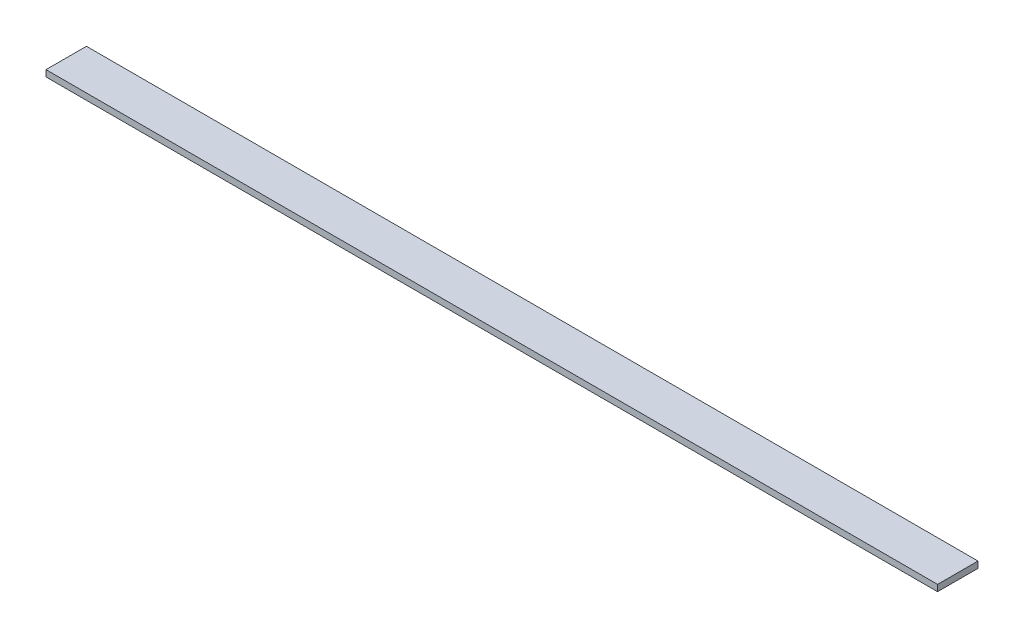
ISO-10303-21;
HEADER;
FILE_DESCRIPTION(('STEP AP214'),'2;1');
FILE_NAME('part.step','',(''),(''),'','','');
FILE_SCHEMA(('AUTOMOTIVE_DESIGN { 1 0 10303 214 1 1 1 1 }'));
ENDSEC;
DATA;
#1=APPLICATION_CONTEXT('core data for automotive mechanical design processes');
#2=APPLICATION_PROTOCOL_DEFINITION('international standard','automotive_design',2000,#1);
#3=PRODUCT_CONTEXT('',#1,'mechanical');
#4=PRODUCT('Part','Part','',(#3));
#5=PRODUCT_RELATED_PRODUCT_CATEGORY('part','',(#4));
#6=PRODUCT_DEFINITION_FORMATION('','',#4);
#7=PRODUCT_DEFINITION_CONTEXT('part definition',#1,'design');
#8=PRODUCT_DEFINITION('design','',#6,#7);
#9=PRODUCT_DEFINITION_SHAPE('','',#8);
#10=(LENGTH_UNIT() NAMED_UNIT(*) SI_UNIT(.MILLI.,.METRE.));
#11=(NAMED_UNIT(*) PLANE_ANGLE_UNIT() SI_UNIT($,.RADIAN.));
#12=(NAMED_UNIT(*) SI_UNIT($,.STERADIAN.) SOLID_ANGLE_UNIT());
#13=UNCERTAINTY_MEASURE_WITH_UNIT(LENGTH_MEASURE(1.E-05),#10,'distance_accuracy_value','');
#14=(GEOMETRIC_REPRESENTATION_CONTEXT(3) GLOBAL_UNCERTAINTY_ASSIGNED_CONTEXT((#13)) GLOBAL_UNIT_ASSIGNED_CONTEXT((#10,
#11,#12)) REPRESENTATION_CONTEXT('',''));
#15=CARTESIAN_POINT('',(0.,0.,0.));
#16=DIRECTION('',(0.,0.,1.));
#17=DIRECTION('',(1.,0.,0.));
#18=AXIS2_PLACEMENT_3D('',#15,#16,#17);
#19=CARTESIAN_POINT('',(0.,2.,0.));
#20=DIRECTION('',(-1.,0.,0.));
#21=DIRECTION('',(0.,0.,1.));
#22=AXIS2_PLACEMENT_3D('',#19,#20,#21);
#23=PLANE('',#22);
#24=DIRECTION('',(0.,0.,-1.));
#25=VECTOR('',#24,1.);
#26=CARTESIAN_POINT('',(0.,0.,0.));
#27=LINE('',#26,#25);
#28=CARTESIAN_POINT('',(0.,0.,12.7));
#29=VERTEX_POINT('',#28);
#30=CARTESIAN_POINT('',(0.,0.,0.));
#31=VERTEX_POINT('',#30);
#32=EDGE_CURVE('E107',#29,#31,#27,.T.);
#33=ORIENTED_EDGE('',*,*,#32,.T.);
#34=DIRECTION('',(0.,-1.,0.));
#35=VECTOR('',#34,1.);
#36=CARTESIAN_POINT('',(0.,2.,0.));
#37=LINE('',#36,#35);
#38=CARTESIAN_POINT('',(0.,2.,0.));
#39=VERTEX_POINT('',#38);
#40=EDGE_CURVE('E11',#39,#31,#37,.T.);
#41=ORIENTED_EDGE('',*,*,#40,.F.);
#42=DIRECTION('',(0.,0.,-1.));
#43=VECTOR('',#42,1.);
#44=CARTESIAN_POINT('',(0.,2.,0.));
#45=LINE('',#44,#43);
#46=CARTESIAN_POINT('',(0.,2.,12.7));
#47=VERTEX_POINT('',#46);
#48=EDGE_CURVE('E91',#47,#39,#45,.T.);
#49=ORIENTED_EDGE('',*,*,#48,.F.);
#50=DIRECTION('',(0.,-1.,0.));
#51=VECTOR('',#50,1.);
#52=CARTESIAN_POINT('',(0.,2.,12.7));
#53=LINE('',#52,#51);
#54=EDGE_CURVE('E103',#47,#29,#53,.T.);
#55=ORIENTED_EDGE('',*,*,#54,.T.);
#56=EDGE_LOOP('',(#33,#41,#49,#55));
#57=FACE_BOUND('',#56,.T.);
#58=ADVANCED_FACE('F39',(#57),#23,.F.);
#59=CARTESIAN_POINT('',(0.,2.,0.));
#60=DIRECTION('',(0.,0.,1.));
#61=DIRECTION('',(1.,0.,0.));
#62=AXIS2_PLACEMENT_3D('',#59,#60,#61);
#63=PLANE('',#62);
#64=DIRECTION('',(-1.,0.,0.));
#65=VECTOR('',#64,1.);
#66=CARTESIAN_POINT('',(0.,0.,0.));
#67=LINE('',#66,#65);
#68=CARTESIAN_POINT('',(-280.,0.,0.));
#69=VERTEX_POINT('',#68);
#70=EDGE_CURVE('E96',#31,#69,#67,.T.);
#71=ORIENTED_EDGE('',*,*,#70,.T.);
#72=DIRECTION('',(0.,-1.,0.));
#73=VECTOR('',#72,1.);
#74=CARTESIAN_POINT('',(-280.,2.,0.));
#75=LINE('',#74,#73);
#76=CARTESIAN_POINT('',(-280.,2.,0.));
#77=VERTEX_POINT('',#76);
#78=EDGE_CURVE('E48',#77,#69,#75,.T.);
#79=ORIENTED_EDGE('',*,*,#78,.F.);
#80=DIRECTION('',(-1.,0.,0.));
#81=VECTOR('',#80,1.);
#82=CARTESIAN_POINT('',(0.,2.,0.));
#83=LINE('',#82,#81);
#84=EDGE_CURVE('E86',#39,#77,#83,.T.);
#85=ORIENTED_EDGE('',*,*,#84,.F.);
#86=ORIENTED_EDGE('',*,*,#40,.T.);
#87=EDGE_LOOP('',(#71,#79,#85,#86));
#88=FACE_BOUND('',#87,.T.);
#89=ADVANCED_FACE('F95',(#88),#63,.F.);
#90=CARTESIAN_POINT('',(-280.,2.,0.));
#91=DIRECTION('',(1.,0.,0.));
#92=DIRECTION('',(0.,0.,-1.));
#93=AXIS2_PLACEMENT_3D('',#90,#91,#92);
#94=PLANE('',#93);
#95=DIRECTION('',(0.,0.,1.));
#96=VECTOR('',#95,1.);
#97=CARTESIAN_POINT('',(-280.,0.,0.));
#98=LINE('',#97,#96);
#99=CARTESIAN_POINT('',(-280.,0.,12.7));
#100=VERTEX_POINT('',#99);
#101=EDGE_CURVE('E73',#69,#100,#98,.T.);
#102=ORIENTED_EDGE('',*,*,#101,.T.);
#103=DIRECTION('',(0.,-1.,0.));
#104=VECTOR('',#103,1.);
#105=CARTESIAN_POINT('',(-280.,2.,12.7));
#106=LINE('',#105,#104);
#107=CARTESIAN_POINT('',(-280.,2.,12.7));
#108=VERTEX_POINT('',#107);
#109=EDGE_CURVE('E98',#108,#100,#106,.T.);
#110=ORIENTED_EDGE('',*,*,#109,.F.);
#111=DIRECTION('',(0.,0.,1.));
#112=VECTOR('',#111,1.);
#113=CARTESIAN_POINT('',(-280.,2.,0.));
#114=LINE('',#113,#112);
#115=EDGE_CURVE('E89',#77,#108,#114,.T.);
#116=ORIENTED_EDGE('',*,*,#115,.F.);
#117=ORIENTED_EDGE('',*,*,#78,.T.);
#118=EDGE_LOOP('',(#102,#110,#116,#117));
#119=FACE_BOUND('',#118,.T.);
#120=ADVANCED_FACE('F99',(#119),#94,.F.);
#121=CARTESIAN_POINT('',(0.,2.,12.7));
#122=DIRECTION('',(0.,0.,-1.));
#123=DIRECTION('',(-1.,0.,0.));
#124=AXIS2_PLACEMENT_3D('',#121,#122,#123);
#125=PLANE('',#124);
#126=DIRECTION('',(1.,0.,0.));
#127=VECTOR('',#126,1.);
#128=CARTESIAN_POINT('',(0.,0.,12.7));
#129=LINE('',#128,#127);
#130=EDGE_CURVE('E79',#100,#29,#129,.T.);
#131=ORIENTED_EDGE('',*,*,#130,.T.);
#132=ORIENTED_EDGE('',*,*,#54,.F.);
#133=DIRECTION('',(1.,0.,0.));
#134=VECTOR('',#133,1.);
#135=CARTESIAN_POINT('',(0.,2.,12.7));
#136=LINE('',#135,#134);
#137=EDGE_CURVE('E56',#108,#47,#136,.T.);
#138=ORIENTED_EDGE('',*,*,#137,.F.);
#139=ORIENTED_EDGE('',*,*,#109,.T.);
#140=EDGE_LOOP('',(#131,#132,#138,#139));
#141=FACE_BOUND('',#140,.T.);
#142=ADVANCED_FACE('F120',(#141),#125,.F.);
#143=CARTESIAN_POINT('',(0.,2.,0.));
#144=DIRECTION('',(0.,-1.,0.));
#145=DIRECTION('',(0.,0.,-1.));
#146=AXIS2_PLACEMENT_3D('',#143,#144,#145);
#147=PLANE('',#146);
#148=ORIENTED_EDGE('',*,*,#48,.T.);
#149=ORIENTED_EDGE('',*,*,#84,.T.);
#150=ORIENTED_EDGE('',*,*,#115,.T.);
#151=ORIENTED_EDGE('',*,*,#137,.T.);
#152=EDGE_LOOP('',(#148,#149,#150,#151));
#153=FACE_BOUND('',#152,.T.);
#154=ADVANCED_FACE('F87',(#153),#147,.F.);
#155=CARTESIAN_POINT('',(0.,0.,0.));
#156=DIRECTION('',(0.,-1.,0.));
#157=DIRECTION('',(0.,0.,-1.));
#158=AXIS2_PLACEMENT_3D('',#155,#156,#157);
#159=PLANE('',#158);
#160=ORIENTED_EDGE('',*,*,#32,.F.);
#161=ORIENTED_EDGE('',*,*,#130,.F.);
#162=ORIENTED_EDGE('',*,*,#101,.F.);
#163=ORIENTED_EDGE('',*,*,#70,.F.);
#164=EDGE_LOOP('',(#160,#161,#162,#163));
#165=FACE_BOUND('',#164,.T.);
#166=ADVANCED_FACE('F123',(#165),#159,.T.);
#167=CLOSED_SHELL('',(#58,#89,#120,#142,#154,#166));
#168=MANIFOLD_SOLID_BREP('B2',#167);
#169=ADVANCED_BREP_SHAPE_REPRESENTATION('',(#18,#168),#14);
#170=SHAPE_DEFINITION_REPRESENTATION(#9,#169);
ENDSEC;
END-ISO-10303-21;
